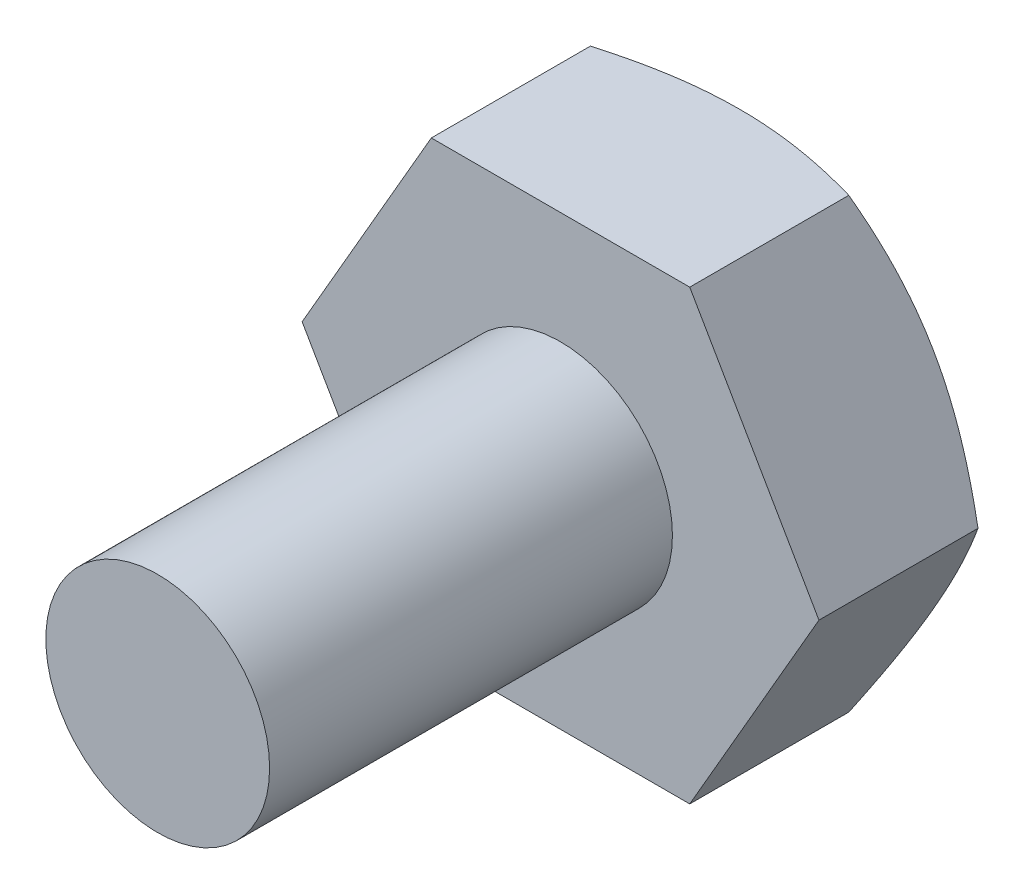
ISO-10303-21;
HEADER;
FILE_DESCRIPTION(('STEP AP214'),'2;1');
FILE_NAME('part.step','',(''),(''),'','','');
FILE_SCHEMA(('AUTOMOTIVE_DESIGN { 1 0 10303 214 1 1 1 1 }'));
ENDSEC;
DATA;
#1=APPLICATION_CONTEXT('core data for automotive mechanical design processes');
#2=APPLICATION_PROTOCOL_DEFINITION('international standard','automotive_design',2000,#1);
#3=PRODUCT_CONTEXT('',#1,'mechanical');
#4=PRODUCT('Part','Part','',(#3));
#5=PRODUCT_RELATED_PRODUCT_CATEGORY('part','',(#4));
#6=PRODUCT_DEFINITION_FORMATION('','',#4);
#7=PRODUCT_DEFINITION_CONTEXT('part definition',#1,'design');
#8=PRODUCT_DEFINITION('design','',#6,#7);
#9=PRODUCT_DEFINITION_SHAPE('','',#8);
#10=(LENGTH_UNIT() NAMED_UNIT(*) SI_UNIT(.MILLI.,.METRE.));
#11=(NAMED_UNIT(*) PLANE_ANGLE_UNIT() SI_UNIT($,.RADIAN.));
#12=(NAMED_UNIT(*) SI_UNIT($,.STERADIAN.) SOLID_ANGLE_UNIT());
#13=UNCERTAINTY_MEASURE_WITH_UNIT(LENGTH_MEASURE(1.E-05),#10,'distance_accuracy_value','');
#14=(GEOMETRIC_REPRESENTATION_CONTEXT(3) GLOBAL_UNCERTAINTY_ASSIGNED_CONTEXT((#13)) GLOBAL_UNIT_ASSIGNED_CONTEXT((#10,
#11,#12)) REPRESENTATION_CONTEXT('',''));
#15=CARTESIAN_POINT('',(0.,0.,0.));
#16=DIRECTION('',(0.,0.,1.));
#17=DIRECTION('',(1.,0.,0.));
#18=AXIS2_PLACEMENT_3D('',#15,#16,#17);
#19=CARTESIAN_POINT('',(2.88675134594819,-4.99999999999997,4.));
#20=DIRECTION('',(-0.866025403784441,0.499999999999995,0.));
#21=DIRECTION('',(-0.499999999999995,-0.866025403784442,0.));
#22=AXIS2_PLACEMENT_3D('',#19,#20,#21);
#23=PLANE('',#22);
#24=CARTESIAN_POINT('',(5.7736181619501,0.0002,0.446648656051831));
#25=CARTESIAN_POINT('',(5.64675433465071,-0.219534594525186,0.373386567637638));
#26=CARTESIAN_POINT('',(5.5188054379059,-0.441148584459583,0.306751321918096));
#27=CARTESIAN_POINT('',(5.26069210252319,-0.888213995453518,0.190438991010816));
#28=CARTESIAN_POINT('',(5.13052307794722,-1.11367335959078,0.140803049915795));
#29=CARTESIAN_POINT('',(4.87177839004642,-1.56183230522352,0.0635510254187059));
#30=CARTESIAN_POINT('',(4.74324302208388,-1.7844620931042,0.0354203782834982));
#31=CARTESIAN_POINT('',(4.54998783160118,-2.11918990184665,0.0101949219536947));
#32=CARTESIAN_POINT('',(4.48552534905129,-2.23084219680507,0.00461345976949463));
#33=CARTESIAN_POINT('',(4.35654081066913,-2.45424997067381,-0.000797783248518256));
#34=CARTESIAN_POINT('',(4.29201875673852,-2.56600544629033,-0.000627741741784736));
#35=CARTESIAN_POINT('',(4.11524635305246,-2.87218423085065,0.00775363179204965));
#36=CARTESIAN_POINT('',(4.00305457769149,-3.06650608596722,0.0218297718972654));
#37=CARTESIAN_POINT('',(3.77941563226461,-3.4538601019977,0.0664652571094446));
#38=CARTESIAN_POINT('',(3.66796924828422,-3.64689090137156,0.0970398601475209));
#39=CARTESIAN_POINT('',(3.44387972423148,-4.03502534247484,0.173468493621174));
#40=CARTESIAN_POINT('',(3.33126486598685,-4.23007999864172,0.219646378878689));
#41=CARTESIAN_POINT('',(3.10771464157946,-4.61728034535874,0.32445179449194));
#42=CARTESIAN_POINT('',(2.99677641204853,-4.80943099540806,0.383054703437378));
#43=CARTESIAN_POINT('',(2.88663587589435,-5.00019999999997,0.44664865605183));
#44=B_SPLINE_CURVE_WITH_KNOTS('',3,(#24,#25,#26,#27,#28,#29,#30,#31,#32,#33,#34,#35,#36,#37,#38,
#39,#40,#41,#42,#43),.UNSPECIFIED.,.F.,.F.,(4,2,2,2,2,2,2,2,2,4),(0.,0.792555841363092,
1.58701660053334,2.36181537487281,2.74884076077326,3.13585419177295,3.80962362599678,
4.48401723901186,5.17336882348924,5.86136694793719),.UNSPECIFIED.);
#45=CARTESIAN_POINT('',(5.77350269189626,0.,0.446581987385204));
#46=VERTEX_POINT('',#45);
#47=CARTESIAN_POINT('',(4.33012701892221,-2.49999999999998,0.));
#48=VERTEX_POINT('',#47);
#49=EDGE_CURVE('E142',#46,#48,#44,.T.);
#50=ORIENTED_EDGE('',*,*,#49,.F.);
#51=DIRECTION('',(0.,0.,-1.));
#52=VECTOR('',#51,1.);
#53=CARTESIAN_POINT('',(5.77350269189626,0.,4.));
#54=LINE('',#53,#52);
#55=CARTESIAN_POINT('',(5.77350269189626,0.,4.));
#56=VERTEX_POINT('',#55);
#57=EDGE_CURVE('E153',#56,#46,#54,.T.);
#58=ORIENTED_EDGE('',*,*,#57,.F.);
#59=DIRECTION('',(0.499999999999995,0.866025403784441,0.));
#60=VECTOR('',#59,1.);
#61=CARTESIAN_POINT('',(2.88675134594819,-4.99999999999997,4.));
#62=LINE('',#61,#60);
#63=CARTESIAN_POINT('',(2.88675134594819,-4.99999999999997,4.));
#64=VERTEX_POINT('',#63);
#65=EDGE_CURVE('E246',#64,#56,#62,.T.);
#66=ORIENTED_EDGE('',*,*,#65,.F.);
#67=DIRECTION('',(0.,0.,-1.));
#68=VECTOR('',#67,1.);
#69=CARTESIAN_POINT('',(2.88675134594819,-4.99999999999997,4.));
#70=LINE('',#69,#68);
#71=CARTESIAN_POINT('',(2.88675134594819,-4.99999999999997,0.446581987385204));
#72=VERTEX_POINT('',#71);
#73=EDGE_CURVE('E236',#64,#72,#70,.T.);
#74=ORIENTED_EDGE('',*,*,#73,.T.);
#75=EDGE_CURVE('E203',#48,#72,#44,.T.);
#76=ORIENTED_EDGE('',*,*,#75,.F.);
#77=EDGE_LOOP('',(#50,#58,#66,#74,#76));
#78=FACE_BOUND('',#77,.T.);
#79=ADVANCED_FACE('F52',(#78),#23,.F.);
#80=CARTESIAN_POINT('',(5.77350269189626,0.,4.));
#81=DIRECTION('',(-0.866025403784438,-0.500000000000001,0.));
#82=DIRECTION('',(0.500000000000001,-0.866025403784438,0.));
#83=AXIS2_PLACEMENT_3D('',#80,#81,#82);
#84=PLANE('',#83);
#85=CARTESIAN_POINT('',(2.88663587589428,5.00020000000001,0.446648656051831));
#86=CARTESIAN_POINT('',(3.01349970319367,4.78046540547483,0.373386567637637));
#87=CARTESIAN_POINT('',(3.14144859993848,4.55885141554043,0.306751321918094));
#88=CARTESIAN_POINT('',(3.3995619353212,4.1117860045465,0.190438991010812));
#89=CARTESIAN_POINT('',(3.52973095989717,3.88632664040924,0.14080304991579));
#90=CARTESIAN_POINT('',(3.78847564779797,3.4381676947765,0.0635510254186991));
#91=CARTESIAN_POINT('',(3.91701101576051,3.21553790689582,0.0354203782834904));
#92=CARTESIAN_POINT('',(4.11026620624322,2.88081009815337,0.0101949219536853));
#93=CARTESIAN_POINT('',(4.1747286887931,2.76915780319495,0.00461345976948467));
#94=CARTESIAN_POINT('',(4.30371322717527,2.54575002932621,-0.000797783248529344));
#95=CARTESIAN_POINT('',(4.36823528110588,2.4339945537097,-0.00062774174179635));
#96=CARTESIAN_POINT('',(4.54500768479194,2.12781576914937,0.0077536317920367));
#97=CARTESIAN_POINT('',(4.65719946015292,1.93349391403279,0.0218297718972521));
#98=CARTESIAN_POINT('',(4.88083840557981,1.5461398980023,0.0664652571094317));
#99=CARTESIAN_POINT('',(4.9922847895602,1.35310909862844,0.0970398601475088));
#100=CARTESIAN_POINT('',(5.21637431361295,0.96497465752515,0.173468493621165));
#101=CARTESIAN_POINT('',(5.32898917185759,0.769920001358268,0.219646378878681));
#102=CARTESIAN_POINT('',(5.55253939626498,0.382719654641234,0.324451794491936));
#103=CARTESIAN_POINT('',(5.66347762579592,0.190569004591915,0.383054703437376));
#104=CARTESIAN_POINT('',(5.7736181619501,-0.000199999999999565,0.446648656051831));
#105=B_SPLINE_CURVE_WITH_KNOTS('',3,(#85,#86,#87,#88,#89,#90,#91,#92,#93,#94,#95,#96,#97,#98,
#99,#100,#101,#102,#103,#104),.UNSPECIFIED.,.F.,.F.,(4,2,2,2,2,2,2,2,2,4),(0.,0.792555841363091,
1.58701660053334,2.36181537487281,2.74884076077326,3.13585419177295,3.8096236259968,
4.4840172390119,5.1733688234893,5.86136694793727),.UNSPECIFIED.);
#106=CARTESIAN_POINT('',(2.88675134594812,5.00000000000001,0.446581987385205));
#107=VERTEX_POINT('',#106);
#108=CARTESIAN_POINT('',(4.33012701892219,2.50000000000001,0.));
#109=VERTEX_POINT('',#108);
#110=EDGE_CURVE('E123',#107,#109,#105,.T.);
#111=ORIENTED_EDGE('',*,*,#110,.F.);
#112=DIRECTION('',(0.,0.,-1.));
#113=VECTOR('',#112,1.);
#114=CARTESIAN_POINT('',(2.88675134594812,5.00000000000001,4.));
#115=LINE('',#114,#113);
#116=CARTESIAN_POINT('',(2.88675134594812,5.00000000000001,4.));
#117=VERTEX_POINT('',#116);
#118=EDGE_CURVE('E233',#117,#107,#115,.T.);
#119=ORIENTED_EDGE('',*,*,#118,.F.);
#120=DIRECTION('',(-0.500000000000001,0.866025403784438,0.));
#121=VECTOR('',#120,1.);
#122=CARTESIAN_POINT('',(5.77350269189626,0.,4.));
#123=LINE('',#122,#121);
#124=EDGE_CURVE('E249',#56,#117,#123,.T.);
#125=ORIENTED_EDGE('',*,*,#124,.F.);
#126=ORIENTED_EDGE('',*,*,#57,.T.);
#127=EDGE_CURVE('E135',#109,#46,#105,.T.);
#128=ORIENTED_EDGE('',*,*,#127,.F.);
#129=EDGE_LOOP('',(#111,#119,#125,#126,#128));
#130=FACE_BOUND('',#129,.T.);
#131=ADVANCED_FACE('F151',(#130),#84,.F.);
#132=CARTESIAN_POINT('',(2.88675134594812,5.00000000000001,4.));
#133=DIRECTION('',(0.,-1.,0.));
#134=DIRECTION('',(1.,0.,0.));
#135=AXIS2_PLACEMENT_3D('',#132,#133,#134);
#136=PLANE('',#135);
#137=CARTESIAN_POINT('',(-9.91072051451666,4.99999999999997,3.52215862681272));
#138=CARTESIAN_POINT('',(-9.68007661520381,4.99999999999997,3.4032853065797));
#139=CARTESIAN_POINT('',(-9.44909987084087,4.99999999999997,3.28505222605123));
#140=CARTESIAN_POINT('',(-8.98632824550953,4.99999999999997,3.0501886147813));
#141=CARTESIAN_POINT('',(-8.7545333497719,4.99999999999997,2.93355811315741));
#142=CARTESIAN_POINT('',(-8.2896065265267,4.99999999999997,2.7020394251415));
#143=CARTESIAN_POINT('',(-8.05647304509114,4.99999999999997,2.58715435388924));
#144=CARTESIAN_POINT('',(-7.58904326134008,4.99999999999997,2.35976241885918));
#145=CARTESIAN_POINT('',(-7.3547469426423,4.99999999999998,2.24725558870459));
#146=CARTESIAN_POINT('',(-6.8723129698728,4.99999999999998,2.01931443968795));
#147=CARTESIAN_POINT('',(-6.62409930968661,4.99999999999998,1.90404054222718));
#148=CARTESIAN_POINT('',(-6.1257864181369,4.99999999999998,1.67766184243909));
#149=CARTESIAN_POINT('',(-5.87568728094291,4.99999999999998,1.56655683353306));
#150=CARTESIAN_POINT('',(-5.3733271894946,4.99999999999998,1.34978754997097));
#151=CARTESIAN_POINT('',(-5.12106777897735,4.99999999999998,1.24411971584987));
#152=CARTESIAN_POINT('',(-4.61364960582794,4.99999999999998,1.0397701101476));
#153=CARTESIAN_POINT('',(-4.35849018989259,4.99999999999999,0.941089950436899));
#154=CARTESIAN_POINT('',(-3.80430352620606,4.99999999999999,0.738151578100352));
#155=CARTESIAN_POINT('',(-3.5046954022381,4.99999999999999,0.635461839747714));
#156=CARTESIAN_POINT('',(-2.90015144876234,4.99999999999999,0.447226418861632));
#157=CARTESIAN_POINT('',(-2.59521837674313,4.99999999999999,0.361672133251815));
#158=CARTESIAN_POINT('',(-2.13656592404897,4.99999999999999,0.251513523318982));
#159=CARTESIAN_POINT('',(-1.98496381510171,4.99999999999999,0.21806474462296));
#160=CARTESIAN_POINT('',(-1.68047779086047,4.99999999999999,0.157564268217784));
#161=CARTESIAN_POINT('',(-1.52759390573784,4.99999999999999,0.130512420368442));
#162=CARTESIAN_POINT('',(-1.22079098060371,5.,0.0835725896765413));
#163=CARTESIAN_POINT('',(-1.06687243609632,5.,0.0636813963332598));
#164=CARTESIAN_POINT('',(-0.758229934383415,5.,0.0316885650562537));
#165=CARTESIAN_POINT('',(-0.603506033241654,5.,0.0195863920225835));
#166=CARTESIAN_POINT('',(-0.291466657759525,5.,0.00348955366555393));
#167=CARTESIAN_POINT('',(-0.13414514451289,5.,-0.000389637813658651));
#168=CARTESIAN_POINT('',(0.180473873615635,5.,0.000451597301700832));
#169=CARTESIAN_POINT('',(0.337771378510185,5.,0.00517201934585777));
#170=CARTESIAN_POINT('',(0.65192605584814,5.,0.0230348355952654));
#171=CARTESIAN_POINT('',(0.808783098636219,5.,0.0361794921415314));
#172=CARTESIAN_POINT('',(1.1216158416391,5.,0.0704096538791143));
#173=CARTESIAN_POINT('',(1.27759151954189,5.,0.0914953591944729));
#174=CARTESIAN_POINT('',(1.75004285896639,5.00000000000001,0.166656124596617));
#175=CARTESIAN_POINT('',(2.06471308296111,5.00000000000001,0.232232347490003));
#176=CARTESIAN_POINT('',(2.68814228505202,5.00000000000001,0.386698870539006));
#177=CARTESIAN_POINT('',(2.99689930166729,5.00000000000001,0.475596767816048));
#178=CARTESIAN_POINT('',(3.59898166031754,5.00000000000001,0.66719948035373));
#179=CARTESIAN_POINT('',(3.89248247684021,5.00000000000001,0.769361966850736));
#180=CARTESIAN_POINT('',(4.47522108816956,5.00000000000002,0.985270633547483));
#181=CARTESIAN_POINT('',(4.76445778872909,5.00000000000002,1.09901972982013));
#182=CARTESIAN_POINT('',(5.33976271845675,5.00000000000002,1.33510151612005));
#183=CARTESIAN_POINT('',(5.62582697366531,5.00000000000002,1.45744381318356));
#184=CARTESIAN_POINT('',(6.19514360632305,5.00000000000002,1.70839249817741));
#185=CARTESIAN_POINT('',(6.47839627247371,5.00000000000002,1.8369982347809));
#186=CARTESIAN_POINT('',(7.02652589131006,5.00000000000002,2.09143746230624));
#187=CARTESIAN_POINT('',(7.2915256553746,5.00000000000003,2.21700745413355));
#188=CARTESIAN_POINT('',(7.81995100968871,5.00000000000003,2.47143242372436));
#189=CARTESIAN_POINT('',(8.08337654668983,5.00000000000003,2.60028751183904));
#190=CARTESIAN_POINT('',(8.6080606990114,5.00000000000003,2.86014762545866));
#191=CARTESIAN_POINT('',(8.86932362073972,5.00000000000003,2.9911439760978));
#192=CARTESIAN_POINT('',(9.39077058022483,5.00000000000003,3.25521245725294));
#193=CARTESIAN_POINT('',(9.65095470976743,5.00000000000003,3.38828440638683));
#194=CARTESIAN_POINT('',(9.91072051451662,5.00000000000003,3.52215862681272));
#195=B_SPLINE_CURVE_WITH_KNOTS('',3,(#137,#138,#139,#140,#141,#142,#143,#144,#145,#146,#147,
#148,#149,#150,#151,#152,#153,#154,#155,#156,#157,#158,#159,#160,#161,#162,#163,#164,#165,#166,
#167,#168,#169,#170,#171,#172,#173,#174,#175,#176,#177,#178,#179,#180,#181,#182,#183,#184,#185,
#186,#187,#188,#189,#190,#191,#192,#193,#194),.UNSPECIFIED.,.F.,.F.,(4,2,2,2,2,2,2,2,2,2,2,2,2,
2,2,2,2,2,2,2,2,2,2,2,2,2,2,2,4),(0.,0.778428945558488,1.55687201589002,2.33657120711729,
3.11628141425076,3.93727695127295,4.75823175206874,5.57864208976689,6.39924106192735,
7.34905647158545,8.29839381208653,8.76402595318229,9.22964716449954,9.69505935239169,
10.1604395633962,10.632312875273,11.104185937462,11.5761857750118,12.048197508325,
13.0111651484689,13.9744468692281,14.90643641849,15.838661109537,16.7719451288143,
17.7051323034725,18.5848401452491,19.4645775767283,20.3413601541157,21.218066535916),.UNSPECIFIED.);
#196=CARTESIAN_POINT('',(-2.88675134594815,4.99999999999999,0.446581987385205));
#197=VERTEX_POINT('',#196);
#198=CARTESIAN_POINT('',(0.,5.,0.));
#199=VERTEX_POINT('',#198);
#200=EDGE_CURVE('E68',#197,#199,#195,.T.);
#201=ORIENTED_EDGE('',*,*,#200,.F.);
#202=DIRECTION('',(0.,0.,-1.));
#203=VECTOR('',#202,1.);
#204=CARTESIAN_POINT('',(-2.88675134594815,4.99999999999999,4.));
#205=LINE('',#204,#203);
#206=CARTESIAN_POINT('',(-2.88675134594815,4.99999999999999,4.));
#207=VERTEX_POINT('',#206);
#208=EDGE_CURVE('E230',#207,#197,#205,.T.);
#209=ORIENTED_EDGE('',*,*,#208,.F.);
#210=DIRECTION('',(-1.,0.,0.));
#211=VECTOR('',#210,1.);
#212=CARTESIAN_POINT('',(2.88675134594812,5.00000000000001,4.));
#213=LINE('',#212,#211);
#214=EDGE_CURVE('E251',#117,#207,#213,.T.);
#215=ORIENTED_EDGE('',*,*,#214,.F.);
#216=ORIENTED_EDGE('',*,*,#118,.T.);
#217=EDGE_CURVE('E129',#199,#107,#195,.T.);
#218=ORIENTED_EDGE('',*,*,#217,.F.);
#219=EDGE_LOOP('',(#201,#209,#215,#216,#218));
#220=FACE_BOUND('',#219,.T.);
#221=ADVANCED_FACE('F277',(#220),#136,.F.);
#222=CARTESIAN_POINT('',(-2.88675134594815,4.99999999999999,4.));
#223=DIRECTION('',(0.866025403784442,-0.499999999999995,0.));
#224=DIRECTION('',(0.499999999999995,0.866025403784442,0.));
#225=AXIS2_PLACEMENT_3D('',#222,#223,#224);
#226=PLANE('',#225);
#227=CARTESIAN_POINT('',(-5.7736181619501,-0.000200000000040525,0.446648656051831));
#228=CARTESIAN_POINT('',(-5.64675433465071,0.219534594525145,0.373386567637637));
#229=CARTESIAN_POINT('',(-5.5188054379059,0.441148584459541,0.306751321918094));
#230=CARTESIAN_POINT('',(-5.26069210252319,0.888213995453476,0.190438991010812));
#231=CARTESIAN_POINT('',(-5.13052307794722,1.11367335959074,0.14080304991579));
#232=CARTESIAN_POINT('',(-4.87177839004642,1.56183230522348,0.0635510254186985));
#233=CARTESIAN_POINT('',(-4.74324302208388,1.78446209310416,0.0354203782834901));
#234=CARTESIAN_POINT('',(-4.54998783160118,2.11918990184661,0.0101949219536847));
#235=CARTESIAN_POINT('',(-4.48552534905129,2.23084219680503,0.0046134597694838));
#236=CARTESIAN_POINT('',(-4.35654081066913,2.45424997067377,-0.000797783248529972));
#237=CARTESIAN_POINT('',(-4.29201875673852,2.56600544629028,-0.000627741741796505));
#238=CARTESIAN_POINT('',(-4.11524635305246,2.87218423085061,0.00775363179203699));
#239=CARTESIAN_POINT('',(-4.00305457769148,3.06650608596719,0.0218297718972517));
#240=CARTESIAN_POINT('',(-3.77941563226459,3.45386010199768,0.0664652571094308));
#241=CARTESIAN_POINT('',(-3.66796924828421,3.64689090137155,0.0970398601475081));
#242=CARTESIAN_POINT('',(-3.44387972423146,4.03502534247484,0.173468493621164));
#243=CARTESIAN_POINT('',(-3.33126486598682,4.23007999864172,0.219646378878681));
#244=CARTESIAN_POINT('',(-3.10771464157943,4.61728034535875,0.324451794491936));
#245=CARTESIAN_POINT('',(-2.99677641204849,4.80943099540807,0.383054703437376));
#246=CARTESIAN_POINT('',(-2.88663587589432,5.00019999999999,0.446648656051831));
#247=B_SPLINE_CURVE_WITH_KNOTS('',3,(#227,#228,#229,#230,#231,#232,#233,#234,#235,#236,#237,
#238,#239,#240,#241,#242,#243,#244,#245,#246),.UNSPECIFIED.,.F.,.F.,(4,2,2,2,2,2,2,2,2,4),(0.,
0.792555841363091,1.58701660053334,2.36181537487281,2.74884076077326,3.13585419177295,
3.8096236259968,4.4840172390119,5.1733688234893,5.86136694793727),.UNSPECIFIED.);
#248=CARTESIAN_POINT('',(-5.77350269189626,0.,0.446581987385204));
#249=VERTEX_POINT('',#248);
#250=CARTESIAN_POINT('',(-4.33012701892221,2.49999999999997,0.));
#251=VERTEX_POINT('',#250);
#252=EDGE_CURVE('E75',#249,#251,#247,.T.);
#253=ORIENTED_EDGE('',*,*,#252,.F.);
#254=DIRECTION('',(0.,0.,-1.));
#255=VECTOR('',#254,1.);
#256=CARTESIAN_POINT('',(-5.77350269189626,0.,4.));
#257=LINE('',#256,#255);
#258=CARTESIAN_POINT('',(-5.77350269189626,0.,4.));
#259=VERTEX_POINT('',#258);
#260=EDGE_CURVE('E224',#259,#249,#257,.T.);
#261=ORIENTED_EDGE('',*,*,#260,.F.);
#262=DIRECTION('',(-0.499999999999995,-0.866025403784442,0.));
#263=VECTOR('',#262,1.);
#264=CARTESIAN_POINT('',(-2.88675134594815,4.99999999999999,4.));
#265=LINE('',#264,#263);
#266=EDGE_CURVE('E253',#207,#259,#265,.T.);
#267=ORIENTED_EDGE('',*,*,#266,.F.);
#268=ORIENTED_EDGE('',*,*,#208,.T.);
#269=EDGE_CURVE('E134',#251,#197,#247,.T.);
#270=ORIENTED_EDGE('',*,*,#269,.F.);
#271=EDGE_LOOP('',(#253,#261,#267,#268,#270));
#272=FACE_BOUND('',#271,.T.);
#273=ADVANCED_FACE('F222',(#272),#226,.F.);
#274=CARTESIAN_POINT('',(-5.77350269189626,0.,4.));
#275=DIRECTION('',(0.866025403784435,0.500000000000007,0.));
#276=DIRECTION('',(-0.500000000000007,0.866025403784435,0.));
#277=AXIS2_PLACEMENT_3D('',#274,#275,#276);
#278=PLANE('',#277);
#279=CARTESIAN_POINT('',(-2.88663587589425,-5.00020000000003,0.44664865605183));
#280=CARTESIAN_POINT('',(-3.01349970319364,-4.78046540547485,0.373386567637636));
#281=CARTESIAN_POINT('',(-3.14144859993845,-4.55885141554045,0.306751321918093));
#282=CARTESIAN_POINT('',(-3.39956193532117,-4.11178600454652,0.190438991010812));
#283=CARTESIAN_POINT('',(-3.52973095989714,-3.88632664040926,0.140803049915789));
#284=CARTESIAN_POINT('',(-3.78847564779794,-3.43816769477653,0.0635510254186979));
#285=CARTESIAN_POINT('',(-3.91701101576049,-3.21553790689584,0.035420378283489));
#286=CARTESIAN_POINT('',(-4.1102662062432,-2.8808100981534,0.0101949219536841));
#287=CARTESIAN_POINT('',(-4.17472868879308,-2.76915780319498,0.00461345976948368));
#288=CARTESIAN_POINT('',(-4.30371322717525,-2.54575002932624,-0.000797783248530093));
#289=CARTESIAN_POINT('',(-4.36823528110586,-2.43399455370973,-0.000627741741797047));
#290=CARTESIAN_POINT('',(-4.54500768479192,-2.1278157691494,0.00775363179203589));
#291=CARTESIAN_POINT('',(-4.65719946015291,-1.93349391403283,0.021829771897251));
#292=CARTESIAN_POINT('',(-4.8808384055798,-1.54613989800233,0.0664652571094305));
#293=CARTESIAN_POINT('',(-4.99228478956019,-1.35310909862847,0.097039860147508));
#294=CARTESIAN_POINT('',(-5.21637431361294,-0.964974657525186,0.173468493621164));
#295=CARTESIAN_POINT('',(-5.32898917185758,-0.769920001358305,0.219646378878681));
#296=CARTESIAN_POINT('',(-5.55253939626498,-0.382719654641272,0.324451794491935));
#297=CARTESIAN_POINT('',(-5.66347762579592,-0.190569004591954,0.383054703437376));
#298=CARTESIAN_POINT('',(-5.7736181619501,0.000199999999959256,0.44664865605183));
#299=B_SPLINE_CURVE_WITH_KNOTS('',3,(#279,#280,#281,#282,#283,#284,#285,#286,#287,#288,#289,
#290,#291,#292,#293,#294,#295,#296,#297,#298),.UNSPECIFIED.,.F.,.F.,(4,2,2,2,2,2,2,2,2,4),(0.,
0.792555841363091,1.58701660053334,2.36181537487281,2.74884076077326,3.13585419177295,
3.8096236259968,4.4840172390119,5.1733688234893,5.86136694793727),.UNSPECIFIED.);
#300=CARTESIAN_POINT('',(-2.8867513459481,-5.00000000000003,0.446581987385194));
#301=VERTEX_POINT('',#300);
#302=CARTESIAN_POINT('',(-4.33012701892217,-2.50000000000004,0.));
#303=VERTEX_POINT('',#302);
#304=EDGE_CURVE('E197',#301,#303,#299,.T.);
#305=ORIENTED_EDGE('',*,*,#304,.F.);
#306=DIRECTION('',(0.,0.,-1.));
#307=VECTOR('',#306,1.);
#308=CARTESIAN_POINT('',(-2.88675134594808,-5.00000000000003,4.));
#309=LINE('',#308,#307);
#310=CARTESIAN_POINT('',(-2.88675134594808,-5.00000000000003,4.));
#311=VERTEX_POINT('',#310);
#312=EDGE_CURVE('E231',#311,#301,#309,.T.);
#313=ORIENTED_EDGE('',*,*,#312,.F.);
#314=DIRECTION('',(0.500000000000007,-0.866025403784435,0.));
#315=VECTOR('',#314,1.);
#316=CARTESIAN_POINT('',(-5.77350269189626,0.,4.));
#317=LINE('',#316,#315);
#318=EDGE_CURVE('E229',#259,#311,#317,.T.);
#319=ORIENTED_EDGE('',*,*,#318,.F.);
#320=ORIENTED_EDGE('',*,*,#260,.T.);
#321=EDGE_CURVE('E154',#303,#249,#299,.T.);
#322=ORIENTED_EDGE('',*,*,#321,.F.);
#323=EDGE_LOOP('',(#305,#313,#319,#320,#322));
#324=FACE_BOUND('',#323,.T.);
#325=ADVANCED_FACE('F227',(#324),#278,.F.);
#326=CARTESIAN_POINT('',(-2.88675134594808,-5.00000000000003,4.));
#327=DIRECTION('',(0.,1.,0.));
#328=DIRECTION('',(-1.,0.,0.));
#329=AXIS2_PLACEMENT_3D('',#326,#327,#328);
#330=PLANE('',#329);
#331=CARTESIAN_POINT('',(9.91072051451669,-4.9999999999999,3.52215862681272));
#332=CARTESIAN_POINT('',(9.68007661520384,-4.9999999999999,3.4032853065797));
#333=CARTESIAN_POINT('',(9.44909987084091,-4.9999999999999,3.28505222605123));
#334=CARTESIAN_POINT('',(8.98632824550957,-4.99999999999991,3.0501886147813));
#335=CARTESIAN_POINT('',(8.75453334977194,-4.99999999999991,2.93355811315741));
#336=CARTESIAN_POINT('',(8.28960652652673,-4.99999999999991,2.7020394251415));
#337=CARTESIAN_POINT('',(8.05647304509118,-4.99999999999992,2.58715435388924));
#338=CARTESIAN_POINT('',(7.58904326134011,-4.99999999999992,2.35976241885918));
#339=CARTESIAN_POINT('',(7.35474694264233,-4.99999999999992,2.24725558870459));
#340=CARTESIAN_POINT('',(6.87231296987284,-4.99999999999993,2.01931443968795));
#341=CARTESIAN_POINT('',(6.62409930968664,-4.99999999999993,1.90404054222718));
#342=CARTESIAN_POINT('',(6.12578641813693,-4.99999999999994,1.67766184243909));
#343=CARTESIAN_POINT('',(5.87568728094295,-4.99999999999994,1.56655683353306));
#344=CARTESIAN_POINT('',(5.37332718949463,-4.99999999999994,1.34978754997097));
#345=CARTESIAN_POINT('',(5.12106777897738,-4.99999999999995,1.24411971584987));
#346=CARTESIAN_POINT('',(4.61364960582798,-4.99999999999995,1.0397701101476));
#347=CARTESIAN_POINT('',(4.35849018989263,-4.99999999999995,0.941089950436899));
#348=CARTESIAN_POINT('',(3.80430352620609,-4.99999999999996,0.738151578100352));
#349=CARTESIAN_POINT('',(3.50469540223813,-4.99999999999996,0.635461839747714));
#350=CARTESIAN_POINT('',(2.90015144876238,-4.99999999999997,0.447226418861632));
#351=CARTESIAN_POINT('',(2.59521837674317,-4.99999999999997,0.361672133251815));
#352=CARTESIAN_POINT('',(2.136565924049,-4.99999999999998,0.251513523318982));
#353=CARTESIAN_POINT('',(1.98496381510175,-4.99999999999998,0.21806474462296));
#354=CARTESIAN_POINT('',(1.6804777908605,-4.99999999999998,0.157564268217784));
#355=CARTESIAN_POINT('',(1.52759390573788,-4.99999999999998,0.130512420368442));
#356=CARTESIAN_POINT('',(1.22079098060374,-4.99999999999999,0.0835725896765414));
#357=CARTESIAN_POINT('',(1.06687243609635,-4.99999999999999,0.0636813963332597));
#358=CARTESIAN_POINT('',(0.758229934383451,-4.99999999999999,0.0316885650562534));
#359=CARTESIAN_POINT('',(0.60350603324169,-4.99999999999999,0.0195863920225832));
#360=CARTESIAN_POINT('',(0.291466657759562,-5.,0.00348955366555366));
#361=CARTESIAN_POINT('',(0.134145144512927,-5.,-0.000389637813658978));
#362=CARTESIAN_POINT('',(-0.180473873615598,-5.,0.000451597301700345));
#363=CARTESIAN_POINT('',(-0.337771378510148,-5.,0.00517201934585725));
#364=CARTESIAN_POINT('',(-0.651926055848104,-5.00000000000001,0.0230348355952648));
#365=CARTESIAN_POINT('',(-0.808783098636183,-5.00000000000001,0.0361794921415308));
#366=CARTESIAN_POINT('',(-1.12161584163907,-5.00000000000001,0.0704096538791136));
#367=CARTESIAN_POINT('',(-1.27759151954186,-5.00000000000001,0.0914953591944722));
#368=CARTESIAN_POINT('',(-1.75004285896635,-5.00000000000002,0.166656124596616));
#369=CARTESIAN_POINT('',(-2.06471308296108,-5.00000000000002,0.232232347490002));
#370=CARTESIAN_POINT('',(-2.68814228505198,-5.00000000000003,0.386698870539005));
#371=CARTESIAN_POINT('',(-2.99689930166726,-5.00000000000003,0.475596767816047));
#372=CARTESIAN_POINT('',(-3.59898166031751,-5.00000000000004,0.66719948035373));
#373=CARTESIAN_POINT('',(-3.89248247684018,-5.00000000000004,0.769361966850735));
#374=CARTESIAN_POINT('',(-4.47522108816953,-5.00000000000005,0.985270633547483));
#375=CARTESIAN_POINT('',(-4.76445778872906,-5.00000000000005,1.09901972982013));
#376=CARTESIAN_POINT('',(-5.33976271845671,-5.00000000000006,1.33510151612005));
#377=CARTESIAN_POINT('',(-5.62582697366527,-5.00000000000006,1.45744381318356));
#378=CARTESIAN_POINT('',(-6.19514360632302,-5.00000000000006,1.70839249817741));
#379=CARTESIAN_POINT('',(-6.47839627247367,-5.00000000000007,1.83699823478089));
#380=CARTESIAN_POINT('',(-7.02652589131003,-5.00000000000007,2.09143746230624));
#381=CARTESIAN_POINT('',(-7.29152565537456,-5.00000000000008,2.21700745413354));
#382=CARTESIAN_POINT('',(-7.81995100968867,-5.00000000000008,2.47143242372436));
#383=CARTESIAN_POINT('',(-8.08337654668979,-5.00000000000008,2.60028751183903));
#384=CARTESIAN_POINT('',(-8.60806069901136,-5.00000000000009,2.86014762545866));
#385=CARTESIAN_POINT('',(-8.86932362073969,-5.00000000000009,2.9911439760978));
#386=CARTESIAN_POINT('',(-9.3907705802248,-5.0000000000001,3.25521245725294));
#387=CARTESIAN_POINT('',(-9.65095470976739,-5.0000000000001,3.38828440638683));
#388=CARTESIAN_POINT('',(-9.91072051451659,-5.0000000000001,3.52215862681272));
#389=B_SPLINE_CURVE_WITH_KNOTS('',3,(#331,#332,#333,#334,#335,#336,#337,#338,#339,#340,#341,
#342,#343,#344,#345,#346,#347,#348,#349,#350,#351,#352,#353,#354,#355,#356,#357,#358,#359,#360,
#361,#362,#363,#364,#365,#366,#367,#368,#369,#370,#371,#372,#373,#374,#375,#376,#377,#378,#379,
#380,#381,#382,#383,#384,#385,#386,#387,#388),.UNSPECIFIED.,.F.,.F.,(4,2,2,2,2,2,2,2,2,2,2,2,2,
2,2,2,2,2,2,2,2,2,2,2,2,2,2,2,4),(0.,0.77842894555849,1.55687201589002,2.33657120711729,
3.11628141425076,3.93727695127295,4.75823175206875,5.57864208976689,6.39924106192735,
7.34905647158545,8.29839381208654,8.76402595318229,9.22964716449954,9.69505935239169,
10.1604395633962,10.632312875273,11.104185937462,11.5761857750118,12.048197508325,
13.0111651484689,13.9744468692281,14.90643641849,15.838661109537,16.7719451288143,
17.7051323034725,18.5848401452491,19.4645775767283,20.3413601541157,21.2180665359161),.UNSPECIFIED.);
#390=CARTESIAN_POINT('',(0.,-5.,0.));
#391=VERTEX_POINT('',#390);
#392=EDGE_CURVE('E211',#72,#391,#389,.T.);
#393=ORIENTED_EDGE('',*,*,#392,.F.);
#394=ORIENTED_EDGE('',*,*,#73,.F.);
#395=DIRECTION('',(1.,0.,0.));
#396=VECTOR('',#395,1.);
#397=CARTESIAN_POINT('',(-2.88675134594808,-5.00000000000003,4.));
#398=LINE('',#397,#396);
#399=EDGE_CURVE('E256',#311,#64,#398,.T.);
#400=ORIENTED_EDGE('',*,*,#399,.F.);
#401=ORIENTED_EDGE('',*,*,#312,.T.);
#402=EDGE_CURVE('E188',#391,#301,#389,.T.);
#403=ORIENTED_EDGE('',*,*,#402,.F.);
#404=EDGE_LOOP('',(#393,#394,#400,#401,#403));
#405=FACE_BOUND('',#404,.T.);
#406=ADVANCED_FACE('F263',(#405),#330,.F.);
#407=CARTESIAN_POINT('',(0.,0.,4.));
#408=DIRECTION('',(0.,0.,1.));
#409=DIRECTION('',(1.,0.,0.));
#410=AXIS2_PLACEMENT_3D('',#407,#408,#409);
#411=PLANE('',#410);
#412=CARTESIAN_POINT('',(0.,0.,4.));
#413=DIRECTION('',(0.,0.,1.));
#414=DIRECTION('',(1.,0.,0.));
#415=AXIS2_PLACEMENT_3D('',#412,#413,#414);
#416=CIRCLE('',#415,2.5);
#417=CARTESIAN_POINT('',(2.5,0.,4.));
#418=VERTEX_POINT('',#417);
#419=EDGE_CURVE('E146',#418,#418,#416,.T.);
#420=ORIENTED_EDGE('',*,*,#419,.F.);
#421=EDGE_LOOP('',(#420));
#422=FACE_BOUND('',#421,.T.);
#423=ORIENTED_EDGE('',*,*,#65,.T.);
#424=ORIENTED_EDGE('',*,*,#124,.T.);
#425=ORIENTED_EDGE('',*,*,#214,.T.);
#426=ORIENTED_EDGE('',*,*,#266,.T.);
#427=ORIENTED_EDGE('',*,*,#318,.T.);
#428=ORIENTED_EDGE('',*,*,#399,.T.);
#429=EDGE_LOOP('',(#423,#424,#425,#426,#427,#428));
#430=FACE_BOUND('',#429,.T.);
#431=ADVANCED_FACE('F292',(#422,#430),#411,.T.);
#432=CARTESIAN_POINT('',(0.,0.,13.));
#433=DIRECTION('',(0.,0.,-1.));
#434=DIRECTION('',(-1.,0.,0.));
#435=AXIS2_PLACEMENT_3D('',#432,#433,#434);
#436=CYLINDRICAL_SURFACE('',#435,2.5);
#437=CARTESIAN_POINT('',(0.,0.,13.));
#438=DIRECTION('',(0.,0.,1.));
#439=DIRECTION('',(1.,0.,0.));
#440=AXIS2_PLACEMENT_3D('',#437,#438,#439);
#441=CIRCLE('',#440,2.5);
#442=CARTESIAN_POINT('',(2.5,0.,13.));
#443=VERTEX_POINT('',#442);
#444=EDGE_CURVE('E245',#443,#443,#441,.T.);
#445=ORIENTED_EDGE('',*,*,#444,.F.);
#446=EDGE_LOOP('',(#445));
#447=FACE_BOUND('',#446,.T.);
#448=ORIENTED_EDGE('',*,*,#419,.T.);
#449=EDGE_LOOP('',(#448));
#450=FACE_BOUND('',#449,.T.);
#451=ADVANCED_FACE('F296',(#447,#450),#436,.T.);
#452=CARTESIAN_POINT('',(0.,0.,13.));
#453=DIRECTION('',(0.,0.,1.));
#454=DIRECTION('',(1.,0.,0.));
#455=AXIS2_PLACEMENT_3D('',#452,#453,#454);
#456=PLANE('',#455);
#457=ORIENTED_EDGE('',*,*,#444,.T.);
#458=EDGE_LOOP('',(#457));
#459=FACE_BOUND('',#458,.T.);
#460=ADVANCED_FACE('F181',(#459),#456,.T.);
#461=CARTESIAN_POINT('',(0.,0.,0.));
#462=DIRECTION('',(0.,0.,1.));
#463=DIRECTION('',(-1.,0.,0.));
#464=AXIS2_PLACEMENT_3D('',#461,#462,#463);
#465=CONICAL_SURFACE('',#464,5.,1.0471975511966);
#466=ORIENTED_EDGE('',*,*,#127,.T.);
#467=ORIENTED_EDGE('',*,*,#49,.T.);
#468=CARTESIAN_POINT('',(0.,0.,0.));
#469=DIRECTION('',(0.,0.,1.));
#470=DIRECTION('',(1.,0.,0.));
#471=AXIS2_PLACEMENT_3D('',#468,#469,#470);
#472=CIRCLE('',#471,5.);
#473=EDGE_CURVE('E56',#48,#109,#472,.T.);
#474=ORIENTED_EDGE('',*,*,#473,.T.);
#475=EDGE_LOOP('',(#466,#467,#474));
#476=FACE_BOUND('',#475,.T.);
#477=ADVANCED_FACE('F140',(#476),#465,.T.);
#478=ORIENTED_EDGE('',*,*,#75,.T.);
#479=ORIENTED_EDGE('',*,*,#392,.T.);
#480=EDGE_CURVE('E145',#391,#48,#472,.T.);
#481=ORIENTED_EDGE('',*,*,#480,.T.);
#482=EDGE_LOOP('',(#478,#479,#481));
#483=FACE_BOUND('',#482,.T.);
#484=ADVANCED_FACE('F265',(#483),#465,.T.);
#485=ORIENTED_EDGE('',*,*,#304,.T.);
#486=EDGE_CURVE('E266',#303,#391,#472,.T.);
#487=ORIENTED_EDGE('',*,*,#486,.T.);
#488=ORIENTED_EDGE('',*,*,#402,.T.);
#489=EDGE_LOOP('',(#485,#487,#488));
#490=FACE_BOUND('',#489,.T.);
#491=ADVANCED_FACE('F180',(#490),#465,.T.);
#492=ORIENTED_EDGE('',*,*,#252,.T.);
#493=EDGE_CURVE('E61',#251,#303,#472,.T.);
#494=ORIENTED_EDGE('',*,*,#493,.T.);
#495=ORIENTED_EDGE('',*,*,#321,.T.);
#496=EDGE_LOOP('',(#492,#494,#495));
#497=FACE_BOUND('',#496,.T.);
#498=ADVANCED_FACE('F179',(#497),#465,.T.);
#499=ORIENTED_EDGE('',*,*,#200,.T.);
#500=CARTESIAN_POINT('',(0.,0.,0.));
#501=DIRECTION('',(0.,0.,-1.));
#502=DIRECTION('',(-1.,0.,0.));
#503=AXIS2_PLACEMENT_3D('',#500,#501,#502);
#504=CIRCLE('',#503,5.);
#505=EDGE_CURVE('E149',#251,#199,#504,.T.);
#506=ORIENTED_EDGE('',*,*,#505,.F.);
#507=ORIENTED_EDGE('',*,*,#269,.T.);
#508=EDGE_LOOP('',(#499,#506,#507));
#509=FACE_BOUND('',#508,.T.);
#510=ADVANCED_FACE('F175',(#509),#465,.T.);
#511=ORIENTED_EDGE('',*,*,#217,.T.);
#512=ORIENTED_EDGE('',*,*,#110,.T.);
#513=EDGE_CURVE('E12',#109,#199,#472,.T.);
#514=ORIENTED_EDGE('',*,*,#513,.T.);
#515=EDGE_LOOP('',(#511,#512,#514));
#516=FACE_BOUND('',#515,.T.);
#517=ADVANCED_FACE('F125',(#516),#465,.T.);
#518=CARTESIAN_POINT('',(0.,0.,0.));
#519=DIRECTION('',(0.,0.,1.));
#520=DIRECTION('',(1.,0.,0.));
#521=AXIS2_PLACEMENT_3D('',#518,#519,#520);
#522=PLANE('',#521);
#523=ORIENTED_EDGE('',*,*,#513,.F.);
#524=ORIENTED_EDGE('',*,*,#473,.F.);
#525=ORIENTED_EDGE('',*,*,#480,.F.);
#526=ORIENTED_EDGE('',*,*,#486,.F.);
#527=ORIENTED_EDGE('',*,*,#493,.F.);
#528=ORIENTED_EDGE('',*,*,#505,.T.);
#529=EDGE_LOOP('',(#523,#524,#525,#526,#527,#528));
#530=FACE_BOUND('',#529,.T.);
#531=ADVANCED_FACE('F147',(#530),#522,.F.);
#532=CLOSED_SHELL('',(#79,#131,#221,#273,#325,#406,#431,#451,#460,#477,#484,#491,#498,#510,#517,#531));
#533=MANIFOLD_SOLID_BREP('B2',#532);
#534=ADVANCED_BREP_SHAPE_REPRESENTATION('',(#18,#533),#14);
#535=SHAPE_DEFINITION_REPRESENTATION(#9,#534);
ENDSEC;
END-ISO-10303-21;
